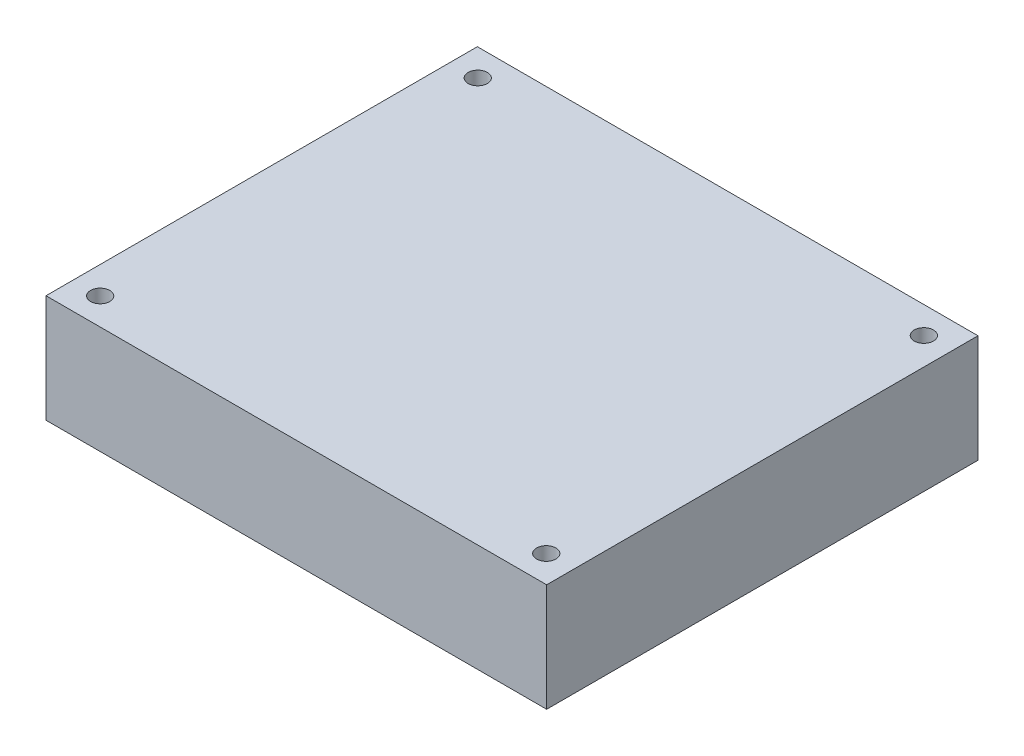
ISO-10303-21;
HEADER;
FILE_DESCRIPTION(('STEP AP214'),'2;1');
FILE_NAME('part.step','',(''),(''),'','','');
FILE_SCHEMA(('AUTOMOTIVE_DESIGN { 1 0 10303 214 1 1 1 1 }'));
ENDSEC;
DATA;
#1=APPLICATION_CONTEXT('core data for automotive mechanical design processes');
#2=APPLICATION_PROTOCOL_DEFINITION('international standard','automotive_design',2000,#1);
#3=PRODUCT_CONTEXT('',#1,'mechanical');
#4=PRODUCT('Part','Part','',(#3));
#5=PRODUCT_RELATED_PRODUCT_CATEGORY('part','',(#4));
#6=PRODUCT_DEFINITION_FORMATION('','',#4);
#7=PRODUCT_DEFINITION_CONTEXT('part definition',#1,'design');
#8=PRODUCT_DEFINITION('design','',#6,#7);
#9=PRODUCT_DEFINITION_SHAPE('','',#8);
#10=(LENGTH_UNIT() NAMED_UNIT(*) SI_UNIT(.MILLI.,.METRE.));
#11=(NAMED_UNIT(*) PLANE_ANGLE_UNIT() SI_UNIT($,.RADIAN.));
#12=(NAMED_UNIT(*) SI_UNIT($,.STERADIAN.) SOLID_ANGLE_UNIT());
#13=UNCERTAINTY_MEASURE_WITH_UNIT(LENGTH_MEASURE(1.E-05),#10,'distance_accuracy_value','');
#14=(GEOMETRIC_REPRESENTATION_CONTEXT(3) GLOBAL_UNCERTAINTY_ASSIGNED_CONTEXT((#13)) GLOBAL_UNIT_ASSIGNED_CONTEXT((#10,
#11,#12)) REPRESENTATION_CONTEXT('',''));
#15=CARTESIAN_POINT('',(0.,0.,0.));
#16=DIRECTION('',(0.,0.,1.));
#17=DIRECTION('',(1.,0.,0.));
#18=AXIS2_PLACEMENT_3D('',#15,#16,#17);
#19=CARTESIAN_POINT('',(32.5,14.,28.));
#20=DIRECTION('',(-1.,0.,0.));
#21=DIRECTION('',(0.,0.,1.));
#22=AXIS2_PLACEMENT_3D('',#19,#20,#21);
#23=PLANE('',#22);
#24=DIRECTION('',(0.,0.,-1.));
#25=VECTOR('',#24,1.);
#26=CARTESIAN_POINT('',(32.5,0.,28.));
#27=LINE('',#26,#25);
#28=CARTESIAN_POINT('',(32.5,0.,28.));
#29=VERTEX_POINT('',#28);
#30=CARTESIAN_POINT('',(32.5,0.,-28.));
#31=VERTEX_POINT('',#30);
#32=EDGE_CURVE('E107',#29,#31,#27,.T.);
#33=ORIENTED_EDGE('',*,*,#32,.T.);
#34=DIRECTION('',(0.,-1.,0.));
#35=VECTOR('',#34,1.);
#36=CARTESIAN_POINT('',(32.5,14.,-28.));
#37=LINE('',#36,#35);
#38=CARTESIAN_POINT('',(32.5,14.,-28.));
#39=VERTEX_POINT('',#38);
#40=EDGE_CURVE('E11',#39,#31,#37,.T.);
#41=ORIENTED_EDGE('',*,*,#40,.F.);
#42=DIRECTION('',(0.,0.,-1.));
#43=VECTOR('',#42,1.);
#44=CARTESIAN_POINT('',(32.5,14.,28.));
#45=LINE('',#44,#43);
#46=CARTESIAN_POINT('',(32.5,14.,28.));
#47=VERTEX_POINT('',#46);
#48=EDGE_CURVE('E91',#47,#39,#45,.T.);
#49=ORIENTED_EDGE('',*,*,#48,.F.);
#50=DIRECTION('',(0.,-1.,0.));
#51=VECTOR('',#50,1.);
#52=CARTESIAN_POINT('',(32.5,14.,28.));
#53=LINE('',#52,#51);
#54=EDGE_CURVE('E103',#47,#29,#53,.T.);
#55=ORIENTED_EDGE('',*,*,#54,.T.);
#56=EDGE_LOOP('',(#33,#41,#49,#55));
#57=FACE_BOUND('',#56,.T.);
#58=ADVANCED_FACE('F39',(#57),#23,.F.);
#59=CARTESIAN_POINT('',(-32.5,14.,-28.));
#60=DIRECTION('',(0.,0.,1.));
#61=DIRECTION('',(1.,0.,0.));
#62=AXIS2_PLACEMENT_3D('',#59,#60,#61);
#63=PLANE('',#62);
#64=DIRECTION('',(-1.,0.,0.));
#65=VECTOR('',#64,1.);
#66=CARTESIAN_POINT('',(-32.5,0.,-28.));
#67=LINE('',#66,#65);
#68=CARTESIAN_POINT('',(-32.5,0.,-28.));
#69=VERTEX_POINT('',#68);
#70=EDGE_CURVE('E96',#31,#69,#67,.T.);
#71=ORIENTED_EDGE('',*,*,#70,.T.);
#72=DIRECTION('',(0.,-1.,0.));
#73=VECTOR('',#72,1.);
#74=CARTESIAN_POINT('',(-32.5,14.,-28.));
#75=LINE('',#74,#73);
#76=CARTESIAN_POINT('',(-32.5,14.,-28.));
#77=VERTEX_POINT('',#76);
#78=EDGE_CURVE('E48',#77,#69,#75,.T.);
#79=ORIENTED_EDGE('',*,*,#78,.F.);
#80=DIRECTION('',(-1.,0.,0.));
#81=VECTOR('',#80,1.);
#82=CARTESIAN_POINT('',(-32.5,14.,-28.));
#83=LINE('',#82,#81);
#84=EDGE_CURVE('E86',#39,#77,#83,.T.);
#85=ORIENTED_EDGE('',*,*,#84,.F.);
#86=ORIENTED_EDGE('',*,*,#40,.T.);
#87=EDGE_LOOP('',(#71,#79,#85,#86));
#88=FACE_BOUND('',#87,.T.);
#89=ADVANCED_FACE('F95',(#88),#63,.F.);
#90=CARTESIAN_POINT('',(-32.5,14.,28.));
#91=DIRECTION('',(1.,0.,0.));
#92=DIRECTION('',(0.,0.,-1.));
#93=AXIS2_PLACEMENT_3D('',#90,#91,#92);
#94=PLANE('',#93);
#95=DIRECTION('',(0.,0.,1.));
#96=VECTOR('',#95,1.);
#97=CARTESIAN_POINT('',(-32.5,0.,28.));
#98=LINE('',#97,#96);
#99=CARTESIAN_POINT('',(-32.5,0.,28.));
#100=VERTEX_POINT('',#99);
#101=EDGE_CURVE('E73',#69,#100,#98,.T.);
#102=ORIENTED_EDGE('',*,*,#101,.T.);
#103=DIRECTION('',(0.,-1.,0.));
#104=VECTOR('',#103,1.);
#105=CARTESIAN_POINT('',(-32.5,14.,28.));
#106=LINE('',#105,#104);
#107=CARTESIAN_POINT('',(-32.5,14.,28.));
#108=VERTEX_POINT('',#107);
#109=EDGE_CURVE('E98',#108,#100,#106,.T.);
#110=ORIENTED_EDGE('',*,*,#109,.F.);
#111=DIRECTION('',(0.,0.,1.));
#112=VECTOR('',#111,1.);
#113=CARTESIAN_POINT('',(-32.5,14.,28.));
#114=LINE('',#113,#112);
#115=EDGE_CURVE('E89',#77,#108,#114,.T.);
#116=ORIENTED_EDGE('',*,*,#115,.F.);
#117=ORIENTED_EDGE('',*,*,#78,.T.);
#118=EDGE_LOOP('',(#102,#110,#116,#117));
#119=FACE_BOUND('',#118,.T.);
#120=ADVANCED_FACE('F99',(#119),#94,.F.);
#121=CARTESIAN_POINT('',(-32.5,14.,28.));
#122=DIRECTION('',(0.,0.,-1.));
#123=DIRECTION('',(-1.,0.,0.));
#124=AXIS2_PLACEMENT_3D('',#121,#122,#123);
#125=PLANE('',#124);
#126=DIRECTION('',(1.,0.,0.));
#127=VECTOR('',#126,1.);
#128=CARTESIAN_POINT('',(-32.5,0.,28.));
#129=LINE('',#128,#127);
#130=EDGE_CURVE('E79',#100,#29,#129,.T.);
#131=ORIENTED_EDGE('',*,*,#130,.T.);
#132=ORIENTED_EDGE('',*,*,#54,.F.);
#133=DIRECTION('',(1.,0.,0.));
#134=VECTOR('',#133,1.);
#135=CARTESIAN_POINT('',(-32.5,14.,28.));
#136=LINE('',#135,#134);
#137=EDGE_CURVE('E56',#108,#47,#136,.T.);
#138=ORIENTED_EDGE('',*,*,#137,.F.);
#139=ORIENTED_EDGE('',*,*,#109,.T.);
#140=EDGE_LOOP('',(#131,#132,#138,#139));
#141=FACE_BOUND('',#140,.T.);
#142=ADVANCED_FACE('F121',(#141),#125,.F.);
#143=CARTESIAN_POINT('',(0.,14.,0.));
#144=DIRECTION('',(0.,-1.,0.));
#145=DIRECTION('',(0.,0.,-1.));
#146=AXIS2_PLACEMENT_3D('',#143,#144,#145);
#147=PLANE('',#146);
#148=CARTESIAN_POINT('',(-28.956,14.,-24.511));
#149=DIRECTION('',(0.,-1.,0.));
#150=DIRECTION('',(0.,0.,-1.));
#151=AXIS2_PLACEMENT_3D('',#148,#149,#150);
#152=CIRCLE('',#151,1.25);
#153=CARTESIAN_POINT('',(-28.956,14.,-25.761));
#154=VERTEX_POINT('',#153);
#155=EDGE_CURVE('E141',#154,#154,#152,.F.);
#156=ORIENTED_EDGE('',*,*,#155,.F.);
#157=EDGE_LOOP('',(#156));
#158=FACE_BOUND('',#157,.T.);
#159=CARTESIAN_POINT('',(-28.956,14.,24.511));
#160=DIRECTION('',(0.,-1.,0.));
#161=DIRECTION('',(0.,0.,-1.));
#162=AXIS2_PLACEMENT_3D('',#159,#160,#161);
#163=CIRCLE('',#162,1.25);
#164=CARTESIAN_POINT('',(-28.956,14.,23.261));
#165=VERTEX_POINT('',#164);
#166=EDGE_CURVE('E140',#165,#165,#163,.F.);
#167=ORIENTED_EDGE('',*,*,#166,.F.);
#168=EDGE_LOOP('',(#167));
#169=FACE_BOUND('',#168,.T.);
#170=CARTESIAN_POINT('',(28.956,14.,24.511));
#171=DIRECTION('',(0.,-1.,0.));
#172=DIRECTION('',(0.,0.,-1.));
#173=AXIS2_PLACEMENT_3D('',#170,#171,#172);
#174=CIRCLE('',#173,1.25);
#175=CARTESIAN_POINT('',(28.956,14.,23.261));
#176=VERTEX_POINT('',#175);
#177=EDGE_CURVE('E149',#176,#176,#174,.F.);
#178=ORIENTED_EDGE('',*,*,#177,.F.);
#179=EDGE_LOOP('',(#178));
#180=FACE_BOUND('',#179,.T.);
#181=CARTESIAN_POINT('',(28.956,14.,-24.511));
#182=DIRECTION('',(0.,-1.,0.));
#183=DIRECTION('',(0.,0.,-1.));
#184=AXIS2_PLACEMENT_3D('',#181,#182,#183);
#185=CIRCLE('',#184,1.25);
#186=CARTESIAN_POINT('',(28.956,14.,-25.761));
#187=VERTEX_POINT('',#186);
#188=EDGE_CURVE('E111',#187,#187,#185,.F.);
#189=ORIENTED_EDGE('',*,*,#188,.F.);
#190=EDGE_LOOP('',(#189));
#191=FACE_BOUND('',#190,.T.);
#192=ORIENTED_EDGE('',*,*,#48,.T.);
#193=ORIENTED_EDGE('',*,*,#84,.T.);
#194=ORIENTED_EDGE('',*,*,#115,.T.);
#195=ORIENTED_EDGE('',*,*,#137,.T.);
#196=EDGE_LOOP('',(#192,#193,#194,#195));
#197=FACE_BOUND('',#196,.T.);
#198=ADVANCED_FACE('F87',(#158,#169,#180,#191,#197),#147,.F.);
#199=CARTESIAN_POINT('',(0.,0.,0.));
#200=DIRECTION('',(0.,-1.,0.));
#201=DIRECTION('',(0.,0.,-1.));
#202=AXIS2_PLACEMENT_3D('',#199,#200,#201);
#203=PLANE('',#202);
#204=CARTESIAN_POINT('',(-28.956,0.,-24.511));
#205=DIRECTION('',(0.,-1.,0.));
#206=DIRECTION('',(0.,0.,-1.));
#207=AXIS2_PLACEMENT_3D('',#204,#205,#206);
#208=CIRCLE('',#207,1.25);
#209=CARTESIAN_POINT('',(-28.956,0.,-25.761));
#210=VERTEX_POINT('',#209);
#211=EDGE_CURVE('E136',#210,#210,#208,.T.);
#212=ORIENTED_EDGE('',*,*,#211,.F.);
#213=EDGE_LOOP('',(#212));
#214=FACE_BOUND('',#213,.T.);
#215=CARTESIAN_POINT('',(-28.956,0.,24.511));
#216=DIRECTION('',(0.,-1.,0.));
#217=DIRECTION('',(0.,0.,-1.));
#218=AXIS2_PLACEMENT_3D('',#215,#216,#217);
#219=CIRCLE('',#218,1.25);
#220=CARTESIAN_POINT('',(-28.956,0.,23.261));
#221=VERTEX_POINT('',#220);
#222=EDGE_CURVE('E145',#221,#221,#219,.T.);
#223=ORIENTED_EDGE('',*,*,#222,.F.);
#224=EDGE_LOOP('',(#223));
#225=FACE_BOUND('',#224,.T.);
#226=CARTESIAN_POINT('',(28.956,0.,24.511));
#227=DIRECTION('',(0.,-1.,0.));
#228=DIRECTION('',(0.,0.,-1.));
#229=AXIS2_PLACEMENT_3D('',#226,#227,#228);
#230=CIRCLE('',#229,1.25);
#231=CARTESIAN_POINT('',(28.956,0.,23.261));
#232=VERTEX_POINT('',#231);
#233=EDGE_CURVE('E135',#232,#232,#230,.T.);
#234=ORIENTED_EDGE('',*,*,#233,.F.);
#235=EDGE_LOOP('',(#234));
#236=FACE_BOUND('',#235,.T.);
#237=CARTESIAN_POINT('',(28.956,0.,-24.511));
#238=DIRECTION('',(0.,-1.,0.));
#239=DIRECTION('',(0.,0.,-1.));
#240=AXIS2_PLACEMENT_3D('',#237,#238,#239);
#241=CIRCLE('',#240,1.25);
#242=CARTESIAN_POINT('',(28.956,0.,-25.761));
#243=VERTEX_POINT('',#242);
#244=EDGE_CURVE('E131',#243,#243,#241,.T.);
#245=ORIENTED_EDGE('',*,*,#244,.F.);
#246=EDGE_LOOP('',(#245));
#247=FACE_BOUND('',#246,.T.);
#248=ORIENTED_EDGE('',*,*,#32,.F.);
#249=ORIENTED_EDGE('',*,*,#130,.F.);
#250=ORIENTED_EDGE('',*,*,#101,.F.);
#251=ORIENTED_EDGE('',*,*,#70,.F.);
#252=EDGE_LOOP('',(#248,#249,#250,#251));
#253=FACE_BOUND('',#252,.T.);
#254=ADVANCED_FACE('F124',(#214,#225,#236,#247,#253),#203,.T.);
#255=CARTESIAN_POINT('',(28.956,17.5355339059327,-24.511));
#256=DIRECTION('',(0.,-1.,0.));
#257=DIRECTION('',(0.,0.,-1.));
#258=AXIS2_PLACEMENT_3D('',#255,#256,#257);
#259=CYLINDRICAL_SURFACE('',#258,1.25);
#260=ORIENTED_EDGE('',*,*,#188,.T.);
#261=EDGE_LOOP('',(#260));
#262=FACE_BOUND('',#261,.T.);
#263=ORIENTED_EDGE('',*,*,#244,.T.);
#264=EDGE_LOOP('',(#263));
#265=FACE_BOUND('',#264,.T.);
#266=ADVANCED_FACE('F169',(#262,#265),#259,.F.);
#267=CARTESIAN_POINT('',(28.956,17.5355339059327,24.511));
#268=DIRECTION('',(0.,-1.,0.));
#269=DIRECTION('',(0.,0.,-1.));
#270=AXIS2_PLACEMENT_3D('',#267,#268,#269);
#271=CYLINDRICAL_SURFACE('',#270,1.25);
#272=ORIENTED_EDGE('',*,*,#177,.T.);
#273=EDGE_LOOP('',(#272));
#274=FACE_BOUND('',#273,.T.);
#275=ORIENTED_EDGE('',*,*,#233,.T.);
#276=EDGE_LOOP('',(#275));
#277=FACE_BOUND('',#276,.T.);
#278=ADVANCED_FACE('F160',(#274,#277),#271,.F.);
#279=CARTESIAN_POINT('',(-28.956,17.5355339059327,24.511));
#280=DIRECTION('',(0.,-1.,0.));
#281=DIRECTION('',(0.,0.,-1.));
#282=AXIS2_PLACEMENT_3D('',#279,#280,#281);
#283=CYLINDRICAL_SURFACE('',#282,1.25);
#284=ORIENTED_EDGE('',*,*,#166,.T.);
#285=EDGE_LOOP('',(#284));
#286=FACE_BOUND('',#285,.T.);
#287=ORIENTED_EDGE('',*,*,#222,.T.);
#288=EDGE_LOOP('',(#287));
#289=FACE_BOUND('',#288,.T.);
#290=ADVANCED_FACE('F219',(#286,#289),#283,.F.);
#291=CARTESIAN_POINT('',(-28.956,17.5355339059327,-24.511));
#292=DIRECTION('',(0.,-1.,0.));
#293=DIRECTION('',(0.,0.,-1.));
#294=AXIS2_PLACEMENT_3D('',#291,#292,#293);
#295=CYLINDRICAL_SURFACE('',#294,1.25);
#296=ORIENTED_EDGE('',*,*,#155,.T.);
#297=EDGE_LOOP('',(#296));
#298=FACE_BOUND('',#297,.T.);
#299=ORIENTED_EDGE('',*,*,#211,.T.);
#300=EDGE_LOOP('',(#299));
#301=FACE_BOUND('',#300,.T.);
#302=ADVANCED_FACE('F228',(#298,#301),#295,.F.);
#303=CLOSED_SHELL('',(#58,#89,#120,#142,#198,#254,#266,#278,#290,#302));
#304=MANIFOLD_SOLID_BREP('B2',#303);
#305=ADVANCED_BREP_SHAPE_REPRESENTATION('',(#18,#304),#14);
#306=SHAPE_DEFINITION_REPRESENTATION(#9,#305);
ENDSEC;
END-ISO-10303-21;
